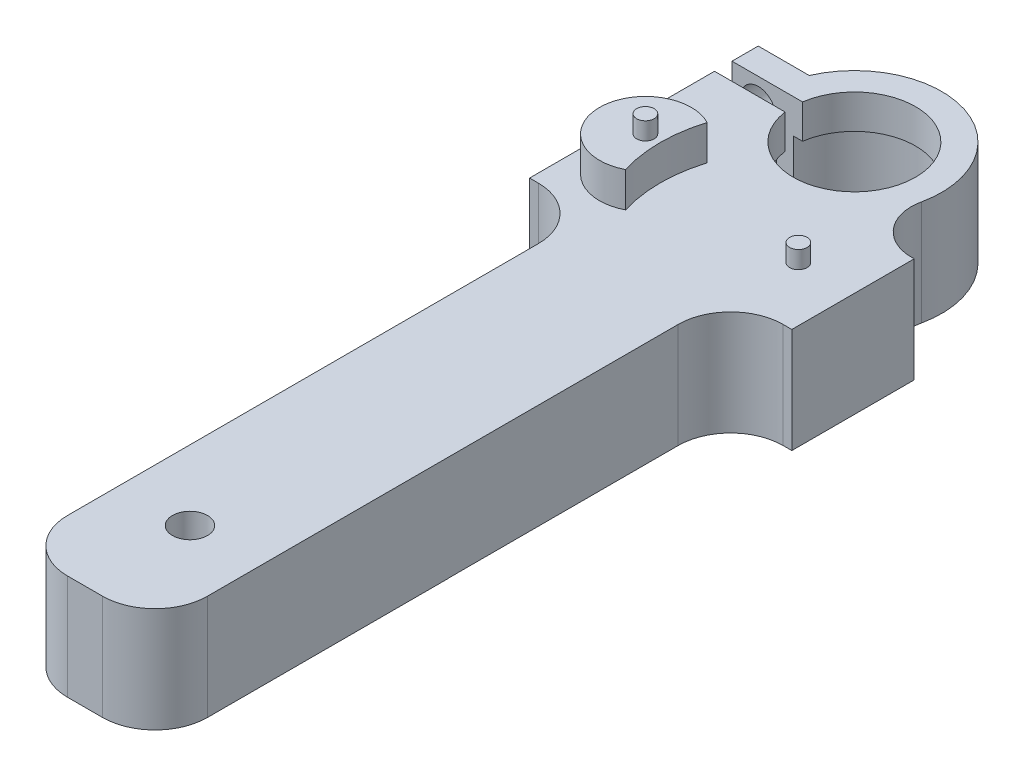
ISO-10303-21;
HEADER;
FILE_DESCRIPTION(('STEP AP214'),'2;1');
FILE_NAME('part.step','',(''),(''),'','','');
FILE_SCHEMA(('AUTOMOTIVE_DESIGN { 1 0 10303 214 1 1 1 1 }'));
ENDSEC;
DATA;
#1=APPLICATION_CONTEXT('core data for automotive mechanical design processes');
#2=APPLICATION_PROTOCOL_DEFINITION('international standard','automotive_design',2000,#1);
#3=PRODUCT_CONTEXT('',#1,'mechanical');
#4=PRODUCT('Part','Part','',(#3));
#5=PRODUCT_RELATED_PRODUCT_CATEGORY('part','',(#4));
#6=PRODUCT_DEFINITION_FORMATION('','',#4);
#7=PRODUCT_DEFINITION_CONTEXT('part definition',#1,'design');
#8=PRODUCT_DEFINITION('design','',#6,#7);
#9=PRODUCT_DEFINITION_SHAPE('','',#8);
#10=(LENGTH_UNIT() NAMED_UNIT(*) SI_UNIT(.MILLI.,.METRE.));
#11=(NAMED_UNIT(*) PLANE_ANGLE_UNIT() SI_UNIT($,.RADIAN.));
#12=(NAMED_UNIT(*) SI_UNIT($,.STERADIAN.) SOLID_ANGLE_UNIT());
#13=UNCERTAINTY_MEASURE_WITH_UNIT(LENGTH_MEASURE(1.E-05),#10,'distance_accuracy_value','');
#14=(GEOMETRIC_REPRESENTATION_CONTEXT(3) GLOBAL_UNCERTAINTY_ASSIGNED_CONTEXT((#13)) GLOBAL_UNIT_ASSIGNED_CONTEXT((#10,
#11,#12)) REPRESENTATION_CONTEXT('',''));
#15=CARTESIAN_POINT('',(0.,0.,0.));
#16=DIRECTION('',(0.,0.,1.));
#17=DIRECTION('',(1.,0.,0.));
#18=AXIS2_PLACEMENT_3D('',#15,#16,#17);
#19=CARTESIAN_POINT('',(0.,3.,-44.));
#20=DIRECTION('',(0.,-1.,0.));
#21=DIRECTION('',(0.,0.,-1.));
#22=AXIS2_PLACEMENT_3D('',#19,#20,#21);
#23=CYLINDRICAL_SURFACE('',#22,5.);
#24=DIRECTION('',(0.,1.,0.));
#25=VECTOR('',#24,1.);
#26=CARTESIAN_POINT('',(4.88811676517046,-7.50105620675398,-42.9481851445908));
#27=LINE('',#26,#25);
#28=CARTESIAN_POINT('',(4.88811676517046,-3.,-42.9481851445908));
#29=VERTEX_POINT('',#28);
#30=CARTESIAN_POINT('',(4.88811676517046,3.,-42.9481851445908));
#31=VERTEX_POINT('',#30);
#32=EDGE_CURVE('E229',#29,#31,#27,.T.);
#33=ORIENTED_EDGE('',*,*,#32,.F.);
#34=CARTESIAN_POINT('',(0.,-3.,-44.));
#35=DIRECTION('',(0.,-1.,0.));
#36=DIRECTION('',(0.,0.,-1.));
#37=AXIS2_PLACEMENT_3D('',#34,#35,#36);
#38=CIRCLE('',#37,5.);
#39=CARTESIAN_POINT('',(-4.58257569495584,-3.,-46.));
#40=VERTEX_POINT('',#39);
#41=EDGE_CURVE('E225',#40,#29,#38,.T.);
#42=ORIENTED_EDGE('',*,*,#41,.F.);
#43=DIRECTION('',(0.,-1.,0.));
#44=VECTOR('',#43,1.);
#45=CARTESIAN_POINT('',(-4.58257569495584,3.,-46.));
#46=LINE('',#45,#44);
#47=CARTESIAN_POINT('',(-4.58257569495584,3.,-46.));
#48=VERTEX_POINT('',#47);
#49=EDGE_CURVE('E387',#40,#48,#46,.F.);
#50=ORIENTED_EDGE('',*,*,#49,.T.);
#51=CARTESIAN_POINT('',(0.,3.,-44.));
#52=DIRECTION('',(0.,1.,0.));
#53=DIRECTION('',(0.,0.,1.));
#54=AXIS2_PLACEMENT_3D('',#51,#52,#53);
#55=CIRCLE('',#54,5.);
#56=EDGE_CURVE('E426',#31,#48,#55,.T.);
#57=ORIENTED_EDGE('',*,*,#56,.F.);
#58=EDGE_LOOP('',(#33,#42,#50,#57));
#59=FACE_BOUND('',#58,.T.);
#60=ADVANCED_FACE('F47',(#59),#23,.T.);
#61=CARTESIAN_POINT('',(-7.5,-16.5529453572468,-32.9222777168862));
#62=DIRECTION('',(-1.,0.,0.));
#63=DIRECTION('',(0.,0.,1.));
#64=AXIS2_PLACEMENT_3D('',#61,#62,#63);
#65=PLANE('',#64);
#66=DIRECTION('',(0.,1.,0.));
#67=VECTOR('',#66,1.);
#68=CARTESIAN_POINT('',(-7.5,0.,-44.5));
#69=LINE('',#68,#67);
#70=CARTESIAN_POINT('',(-7.5,-3.,-44.5));
#71=VERTEX_POINT('',#70);
#72=CARTESIAN_POINT('',(-7.5,3.,-44.5));
#73=VERTEX_POINT('',#72);
#74=EDGE_CURVE('E347',#71,#73,#69,.T.);
#75=ORIENTED_EDGE('',*,*,#74,.T.);
#76=DIRECTION('',(0.,0.,1.));
#77=VECTOR('',#76,1.);
#78=CARTESIAN_POINT('',(-7.5,3.,-32.9222777168862));
#79=LINE('',#78,#77);
#80=CARTESIAN_POINT('',(-7.5,3.,-46.));
#81=VERTEX_POINT('',#80);
#82=EDGE_CURVE('E397',#81,#73,#79,.T.);
#83=ORIENTED_EDGE('',*,*,#82,.F.);
#84=DIRECTION('',(0.,1.,0.));
#85=VECTOR('',#84,1.);
#86=CARTESIAN_POINT('',(-7.5,-7.01346620086376,-46.));
#87=LINE('',#86,#85);
#88=CARTESIAN_POINT('',(-7.5,-3.,-46.));
#89=VERTEX_POINT('',#88);
#90=EDGE_CURVE('E382',#89,#81,#87,.T.);
#91=ORIENTED_EDGE('',*,*,#90,.F.);
#92=DIRECTION('',(0.,0.,-1.));
#93=VECTOR('',#92,1.);
#94=CARTESIAN_POINT('',(-7.5,-3.,-44.5));
#95=LINE('',#94,#93);
#96=EDGE_CURVE('E284',#71,#89,#95,.T.);
#97=ORIENTED_EDGE('',*,*,#96,.F.);
#98=EDGE_LOOP('',(#75,#83,#91,#97));
#99=FACE_BOUND('',#98,.T.);
#100=ADVANCED_FACE('F563',(#99),#65,.T.);
#101=CARTESIAN_POINT('',(0.,3.,-44.));
#102=DIRECTION('',(0.,-1.,0.));
#103=DIRECTION('',(0.,0.,-1.));
#104=AXIS2_PLACEMENT_3D('',#101,#102,#103);
#105=CYLINDRICAL_SURFACE('',#104,4.);
#106=DIRECTION('',(0.,-1.,0.));
#107=VECTOR('',#106,1.);
#108=CARTESIAN_POINT('',(-3.96862696659689,3.,-44.5));
#109=LINE('',#108,#107);
#110=CARTESIAN_POINT('',(-3.96862696659689,-3.,-44.5));
#111=VERTEX_POINT('',#110);
#112=CARTESIAN_POINT('',(-3.96862696659689,1.05,-44.5));
#113=VERTEX_POINT('',#112);
#114=EDGE_CURVE('E364',#111,#113,#109,.F.);
#115=ORIENTED_EDGE('',*,*,#114,.F.);
#116=CARTESIAN_POINT('',(0.,-3.,-44.));
#117=DIRECTION('',(0.,1.,0.));
#118=DIRECTION('',(0.,0.,-1.));
#119=AXIS2_PLACEMENT_3D('',#116,#117,#118);
#120=CIRCLE('',#119,4.);
#121=CARTESIAN_POINT('',(-3.96862696659689,-3.,-43.5));
#122=VERTEX_POINT('',#121);
#123=EDGE_CURVE('E276',#122,#111,#120,.T.);
#124=ORIENTED_EDGE('',*,*,#123,.F.);
#125=DIRECTION('',(0.,-1.,0.));
#126=VECTOR('',#125,1.);
#127=CARTESIAN_POINT('',(-3.96862696659689,3.,-43.5));
#128=LINE('',#127,#126);
#129=CARTESIAN_POINT('',(-3.96862696659689,1.05,-43.5));
#130=VERTEX_POINT('',#129);
#131=EDGE_CURVE('E357',#130,#122,#128,.T.);
#132=ORIENTED_EDGE('',*,*,#131,.F.);
#133=CARTESIAN_POINT('',(0.,1.05,-44.));
#134=DIRECTION('',(0.,1.,0.));
#135=DIRECTION('',(0.,0.,1.));
#136=AXIS2_PLACEMENT_3D('',#133,#134,#135);
#137=CIRCLE('',#136,4.00000000000001);
#138=EDGE_CURVE('E372',#130,#113,#137,.T.);
#139=ORIENTED_EDGE('',*,*,#138,.T.);
#140=EDGE_LOOP('',(#115,#124,#132,#139));
#141=FACE_BOUND('',#140,.T.);
#142=ADVANCED_FACE('F572',(#141),#105,.F.);
#143=CARTESIAN_POINT('',(4.,3.,0.));
#144=DIRECTION('',(-1.,0.,0.));
#145=DIRECTION('',(0.,0.,1.));
#146=AXIS2_PLACEMENT_3D('',#143,#144,#145);
#147=PLANE('',#146);
#148=DIRECTION('',(0.,0.,-1.));
#149=VECTOR('',#148,1.);
#150=CARTESIAN_POINT('',(4.,3.,0.));
#151=LINE('',#150,#149);
#152=CARTESIAN_POINT('',(4.,3.,-3.));
#153=VERTEX_POINT('',#152);
#154=CARTESIAN_POINT('',(4.,3.,-29.9222777168862));
#155=VERTEX_POINT('',#154);
#156=EDGE_CURVE('E437',#153,#155,#151,.T.);
#157=ORIENTED_EDGE('',*,*,#156,.F.);
#158=DIRECTION('',(0.,-1.,0.));
#159=VECTOR('',#158,1.);
#160=CARTESIAN_POINT('',(4.,3.,-3.));
#161=LINE('',#160,#159);
#162=CARTESIAN_POINT('',(4.,-3.01,-3.));
#163=VERTEX_POINT('',#162);
#164=EDGE_CURVE('E483',#153,#163,#161,.T.);
#165=ORIENTED_EDGE('',*,*,#164,.T.);
#166=DIRECTION('',(0.,0.,1.));
#167=VECTOR('',#166,1.);
#168=CARTESIAN_POINT('',(4.,-3.01,-16.7819293264239));
#169=LINE('',#168,#167);
#170=CARTESIAN_POINT('',(4.,-3.01,-16.7819293264239));
#171=VERTEX_POINT('',#170);
#172=EDGE_CURVE('E700',#171,#163,#169,.T.);
#173=ORIENTED_EDGE('',*,*,#172,.F.);
#174=DIRECTION('',(0.,1.,0.));
#175=VECTOR('',#174,1.);
#176=CARTESIAN_POINT('',(4.,-3.01,-16.7819293264239));
#177=LINE('',#176,#175);
#178=CARTESIAN_POINT('',(4.,-3.,-16.7819293264239));
#179=VERTEX_POINT('',#178);
#180=EDGE_CURVE('E246',#171,#179,#177,.T.);
#181=ORIENTED_EDGE('',*,*,#180,.T.);
#182=DIRECTION('',(0.,0.,1.));
#183=VECTOR('',#182,1.);
#184=CARTESIAN_POINT('',(4.,-3.,-32.9222777168862));
#185=LINE('',#184,#183);
#186=CARTESIAN_POINT('',(4.,-3.,-29.9222777168862));
#187=VERTEX_POINT('',#186);
#188=EDGE_CURVE('E259',#187,#179,#185,.T.);
#189=ORIENTED_EDGE('',*,*,#188,.F.);
#190=DIRECTION('',(0.,1.,0.));
#191=VECTOR('',#190,1.);
#192=CARTESIAN_POINT('',(4.,3.,-29.9222777168862));
#193=LINE('',#192,#191);
#194=EDGE_CURVE('E479',#187,#155,#193,.T.);
#195=ORIENTED_EDGE('',*,*,#194,.T.);
#196=EDGE_LOOP('',(#157,#165,#173,#181,#189,#195));
#197=FACE_BOUND('',#196,.T.);
#198=ADVANCED_FACE('F542',(#197),#147,.F.);
#199=CARTESIAN_POINT('',(-4.,3.,0.));
#200=DIRECTION('',(1.,0.,0.));
#201=DIRECTION('',(0.,0.,-1.));
#202=AXIS2_PLACEMENT_3D('',#199,#200,#201);
#203=PLANE('',#202);
#204=DIRECTION('',(0.,0.,-1.));
#205=VECTOR('',#204,1.);
#206=CARTESIAN_POINT('',(-4.,-3.01,0.));
#207=LINE('',#206,#205);
#208=CARTESIAN_POINT('',(-4.,-3.01,-3.));
#209=VERTEX_POINT('',#208);
#210=CARTESIAN_POINT('',(-4.,-3.01,-16.7819293264239));
#211=VERTEX_POINT('',#210);
#212=EDGE_CURVE('E525',#209,#211,#207,.T.);
#213=ORIENTED_EDGE('',*,*,#212,.F.);
#214=DIRECTION('',(0.,-1.,0.));
#215=VECTOR('',#214,1.);
#216=CARTESIAN_POINT('',(-4.,3.,-3.));
#217=LINE('',#216,#215);
#218=CARTESIAN_POINT('',(-4.,3.,-3.));
#219=VERTEX_POINT('',#218);
#220=EDGE_CURVE('E470',#209,#219,#217,.F.);
#221=ORIENTED_EDGE('',*,*,#220,.T.);
#222=DIRECTION('',(0.,0.,1.));
#223=VECTOR('',#222,1.);
#224=CARTESIAN_POINT('',(-4.,3.,0.));
#225=LINE('',#224,#223);
#226=CARTESIAN_POINT('',(-4.,3.,-29.9222777168862));
#227=VERTEX_POINT('',#226);
#228=EDGE_CURVE('E429',#227,#219,#225,.T.);
#229=ORIENTED_EDGE('',*,*,#228,.F.);
#230=DIRECTION('',(0.,-1.,0.));
#231=VECTOR('',#230,1.);
#232=CARTESIAN_POINT('',(-4.,3.,-29.9222777168862));
#233=LINE('',#232,#231);
#234=CARTESIAN_POINT('',(-4.,-3.,-29.9222777168862));
#235=VERTEX_POINT('',#234);
#236=EDGE_CURVE('E466',#227,#235,#233,.T.);
#237=ORIENTED_EDGE('',*,*,#236,.T.);
#238=DIRECTION('',(0.,0.,-1.));
#239=VECTOR('',#238,1.);
#240=CARTESIAN_POINT('',(-4.,-3.,0.));
#241=LINE('',#240,#239);
#242=CARTESIAN_POINT('',(-4.,-3.,-16.7819293264239));
#243=VERTEX_POINT('',#242);
#244=EDGE_CURVE('E262',#243,#235,#241,.T.);
#245=ORIENTED_EDGE('',*,*,#244,.F.);
#246=DIRECTION('',(0.,1.,0.));
#247=VECTOR('',#246,1.);
#248=CARTESIAN_POINT('',(-4.,-3.01,-16.7819293264239));
#249=LINE('',#248,#247);
#250=EDGE_CURVE('E253',#211,#243,#249,.T.);
#251=ORIENTED_EDGE('',*,*,#250,.F.);
#252=EDGE_LOOP('',(#213,#221,#229,#237,#245,#251));
#253=FACE_BOUND('',#252,.T.);
#254=ADVANCED_FACE('F521',(#253),#203,.F.);
#255=CARTESIAN_POINT('',(-4.,3.,0.));
#256=DIRECTION('',(0.,0.,-1.));
#257=DIRECTION('',(-1.,0.,0.));
#258=AXIS2_PLACEMENT_3D('',#255,#256,#257);
#259=PLANE('',#258);
#260=DIRECTION('',(1.,0.,0.));
#261=VECTOR('',#260,1.);
#262=CARTESIAN_POINT('',(-4.,3.,0.));
#263=LINE('',#262,#261);
#264=CARTESIAN_POINT('',(-1.,3.,0.));
#265=VERTEX_POINT('',#264);
#266=CARTESIAN_POINT('',(1.,3.,0.));
#267=VERTEX_POINT('',#266);
#268=EDGE_CURVE('E433',#265,#267,#263,.T.);
#269=ORIENTED_EDGE('',*,*,#268,.F.);
#270=DIRECTION('',(0.,-1.,0.));
#271=VECTOR('',#270,1.);
#272=CARTESIAN_POINT('',(-1.,3.,0.));
#273=LINE('',#272,#271);
#274=CARTESIAN_POINT('',(-1.,-3.01,0.));
#275=VERTEX_POINT('',#274);
#276=EDGE_CURVE('E456',#265,#275,#273,.T.);
#277=ORIENTED_EDGE('',*,*,#276,.T.);
#278=DIRECTION('',(-1.,0.,0.));
#279=VECTOR('',#278,1.);
#280=CARTESIAN_POINT('',(4.,-3.01,0.));
#281=LINE('',#280,#279);
#282=CARTESIAN_POINT('',(1.,-3.01,0.));
#283=VERTEX_POINT('',#282);
#284=EDGE_CURVE('E536',#283,#275,#281,.T.);
#285=ORIENTED_EDGE('',*,*,#284,.F.);
#286=DIRECTION('',(0.,-1.,0.));
#287=VECTOR('',#286,1.);
#288=CARTESIAN_POINT('',(1.,3.,0.));
#289=LINE('',#288,#287);
#290=EDGE_CURVE('E453',#283,#267,#289,.F.);
#291=ORIENTED_EDGE('',*,*,#290,.T.);
#292=EDGE_LOOP('',(#269,#277,#285,#291));
#293=FACE_BOUND('',#292,.T.);
#294=ADVANCED_FACE('F532',(#293),#259,.F.);
#295=CARTESIAN_POINT('',(0.,3.,0.));
#296=DIRECTION('',(0.,-1.,0.));
#297=DIRECTION('',(0.,0.,-1.));
#298=AXIS2_PLACEMENT_3D('',#295,#296,#297);
#299=PLANE('',#298);
#300=CARTESIAN_POINT('',(7.33217514775569,3.,-42.4222777168862));
#301=DIRECTION('',(0.,-1.,0.));
#302=DIRECTION('',(0.,0.,1.));
#303=AXIS2_PLACEMENT_3D('',#300,#301,#302);
#304=CIRCLE('',#303,2.5);
#305=CARTESIAN_POINT('',(7.33217514775569,3.,-39.9222777168862));
#306=VERTEX_POINT('',#305);
#307=EDGE_CURVE('E235',#306,#31,#304,.T.);
#308=ORIENTED_EDGE('',*,*,#307,.T.);
#309=ORIENTED_EDGE('',*,*,#56,.T.);
#310=DIRECTION('',(-1.,0.,0.));
#311=VECTOR('',#310,1.);
#312=CARTESIAN_POINT('',(-4.,3.,-46.));
#313=LINE('',#312,#311);
#314=EDGE_CURVE('E379',#48,#81,#313,.T.);
#315=ORIENTED_EDGE('',*,*,#314,.T.);
#316=ORIENTED_EDGE('',*,*,#82,.T.);
#317=DIRECTION('',(-1.,0.,0.));
#318=VECTOR('',#317,1.);
#319=CARTESIAN_POINT('',(-7.5,3.,-44.5));
#320=LINE('',#319,#318);
#321=CARTESIAN_POINT('',(-3.46410161513776,3.,-44.5));
#322=VERTEX_POINT('',#321);
#323=EDGE_CURVE('E343',#322,#73,#320,.T.);
#324=ORIENTED_EDGE('',*,*,#323,.F.);
#325=CARTESIAN_POINT('',(0.,3.,-44.));
#326=DIRECTION('',(0.,1.,0.));
#327=DIRECTION('',(0.,0.,1.));
#328=AXIS2_PLACEMENT_3D('',#325,#326,#327);
#329=CIRCLE('',#328,3.5);
#330=CARTESIAN_POINT('',(-3.46410161513776,3.,-43.5));
#331=VERTEX_POINT('',#330);
#332=EDGE_CURVE('E367',#331,#322,#329,.T.);
#333=ORIENTED_EDGE('',*,*,#332,.F.);
#334=DIRECTION('',(1.,0.,0.));
#335=VECTOR('',#334,1.);
#336=CARTESIAN_POINT('',(-7.5,3.,-43.5));
#337=LINE('',#336,#335);
#338=CARTESIAN_POINT('',(-7.5,3.,-43.5));
#339=VERTEX_POINT('',#338);
#340=EDGE_CURVE('E340',#339,#331,#337,.T.);
#341=ORIENTED_EDGE('',*,*,#340,.F.);
#342=CARTESIAN_POINT('',(-7.5,3.,-32.9222777168862));
#343=VERTEX_POINT('',#342);
#344=EDGE_CURVE('E401',#339,#343,#79,.T.);
#345=ORIENTED_EDGE('',*,*,#344,.T.);
#346=DIRECTION('',(1.,0.,0.));
#347=VECTOR('',#346,1.);
#348=CARTESIAN_POINT('',(-7.5,3.,-32.9222777168862));
#349=LINE('',#348,#347);
#350=CARTESIAN_POINT('',(-7.,3.,-32.9222777168862));
#351=VERTEX_POINT('',#350);
#352=EDGE_CURVE('E391',#343,#351,#349,.T.);
#353=ORIENTED_EDGE('',*,*,#352,.T.);
#354=CARTESIAN_POINT('',(-7.,3.,-29.9222777168862));
#355=DIRECTION('',(0.,-1.,0.));
#356=DIRECTION('',(0.,0.,-1.));
#357=AXIS2_PLACEMENT_3D('',#354,#355,#356);
#358=CIRCLE('',#357,3.);
#359=EDGE_CURVE('E12',#351,#227,#358,.T.);
#360=ORIENTED_EDGE('',*,*,#359,.T.);
#361=ORIENTED_EDGE('',*,*,#228,.T.);
#362=CARTESIAN_POINT('',(-1.,3.,-3.));
#363=DIRECTION('',(0.,-1.,0.));
#364=DIRECTION('',(0.,0.,-1.));
#365=AXIS2_PLACEMENT_3D('',#362,#363,#364);
#366=CIRCLE('',#365,3.);
#367=EDGE_CURVE('E476',#219,#265,#366,.F.);
#368=ORIENTED_EDGE('',*,*,#367,.T.);
#369=ORIENTED_EDGE('',*,*,#268,.T.);
#370=CARTESIAN_POINT('',(1.,3.,-3.));
#371=DIRECTION('',(0.,-1.,0.));
#372=DIRECTION('',(0.,0.,-1.));
#373=AXIS2_PLACEMENT_3D('',#370,#371,#372);
#374=CIRCLE('',#373,3.);
#375=EDGE_CURVE('E473',#267,#153,#374,.F.);
#376=ORIENTED_EDGE('',*,*,#375,.T.);
#377=ORIENTED_EDGE('',*,*,#156,.T.);
#378=CARTESIAN_POINT('',(7.,3.,-29.9222777168862));
#379=DIRECTION('',(0.,-1.,0.));
#380=DIRECTION('',(0.,0.,-1.));
#381=AXIS2_PLACEMENT_3D('',#378,#379,#380);
#382=CIRCLE('',#381,3.);
#383=CARTESIAN_POINT('',(7.,3.,-32.9222777168862));
#384=VERTEX_POINT('',#383);
#385=EDGE_CURVE('E492',#155,#384,#382,.T.);
#386=ORIENTED_EDGE('',*,*,#385,.T.);
#387=CARTESIAN_POINT('',(7.5,3.,-32.9222777168862));
#388=VERTEX_POINT('',#387);
#389=EDGE_CURVE('E396',#384,#388,#349,.T.);
#390=ORIENTED_EDGE('',*,*,#389,.T.);
#391=DIRECTION('',(0.,0.,-1.));
#392=VECTOR('',#391,1.);
#393=CARTESIAN_POINT('',(7.5,3.,-32.9222777168862));
#394=LINE('',#393,#392);
#395=CARTESIAN_POINT('',(7.5,3.,-39.9222777168862));
#396=VERTEX_POINT('',#395);
#397=EDGE_CURVE('E405',#388,#396,#394,.T.);
#398=ORIENTED_EDGE('',*,*,#397,.T.);
#399=DIRECTION('',(-1.,0.,0.));
#400=VECTOR('',#399,1.);
#401=CARTESIAN_POINT('',(-7.5,3.,-39.9222777168862));
#402=LINE('',#401,#400);
#403=EDGE_CURVE('E402',#396,#306,#402,.T.);
#404=ORIENTED_EDGE('',*,*,#403,.T.);
#405=EDGE_LOOP('',(#308,#309,#315,#316,#324,#333,#341,#345,#353,#360,#361,#368,#369,#376,#377,
#386,#390,#398,#404));
#406=FACE_BOUND('',#405,.T.);
#407=CARTESIAN_POINT('',(4.375,3.,-36.4222777168862));
#408=DIRECTION('',(0.,-1.,0.));
#409=DIRECTION('',(0.,0.,1.));
#410=AXIS2_PLACEMENT_3D('',#407,#408,#409);
#411=CIRCLE('',#410,7.9);
#412=CARTESIAN_POINT('',(-3.17253571428572,3.,-34.0888886276896));
#413=VERTEX_POINT('',#412);
#414=CARTESIAN_POINT('',(-3.17253571428572,3.,-38.7556668060827));
#415=VERTEX_POINT('',#414);
#416=EDGE_CURVE('E309',#413,#415,#411,.T.);
#417=ORIENTED_EDGE('',*,*,#416,.F.);
#418=CARTESIAN_POINT('',(-4.375,3.,-36.4222777168862));
#419=DIRECTION('',(0.,1.,0.));
#420=DIRECTION('',(0.,0.,1.));
#421=AXIS2_PLACEMENT_3D('',#418,#419,#420);
#422=CIRCLE('',#421,2.625);
#423=EDGE_CURVE('E315',#415,#413,#422,.T.);
#424=ORIENTED_EDGE('',*,*,#423,.F.);
#425=EDGE_LOOP('',(#417,#424));
#426=FACE_BOUND('',#425,.T.);
#427=CARTESIAN_POINT('',(4.375,3.,-36.4222777168862));
#428=DIRECTION('',(0.,1.,0.));
#429=DIRECTION('',(0.,0.,1.));
#430=AXIS2_PLACEMENT_3D('',#427,#428,#429);
#431=CIRCLE('',#430,0.500000000000041);
#432=CARTESIAN_POINT('',(4.375,3.,-35.9222777168861));
#433=VERTEX_POINT('',#432);
#434=EDGE_CURVE('E409',#433,#433,#431,.T.);
#435=ORIENTED_EDGE('',*,*,#434,.F.);
#436=EDGE_LOOP('',(#435));
#437=FACE_BOUND('',#436,.T.);
#438=CARTESIAN_POINT('',(0.,2.9999999999998,-6.));
#439=DIRECTION('',(0.,1.,0.));
#440=DIRECTION('',(0.,0.,1.));
#441=AXIS2_PLACEMENT_3D('',#438,#439,#440);
#442=CIRCLE('',#441,0.999999999999987);
#443=CARTESIAN_POINT('',(0.,2.9999999999998,-5.00000000000001));
#444=VERTEX_POINT('',#443);
#445=EDGE_CURVE('E395',#444,#444,#442,.T.);
#446=ORIENTED_EDGE('',*,*,#445,.F.);
#447=EDGE_LOOP('',(#446));
#448=FACE_BOUND('',#447,.T.);
#449=ADVANCED_FACE('F503',(#406,#426,#437,#448),#299,.F.);
#450=CARTESIAN_POINT('',(0.,2.9999999999998,-6.));
#451=DIRECTION('',(0.,1.,0.));
#452=DIRECTION('',(0.,0.,1.));
#453=AXIS2_PLACEMENT_3D('',#450,#451,#452);
#454=CYLINDRICAL_SURFACE('',#453,0.999999999999993);
#455=ORIENTED_EDGE('',*,*,#445,.T.);
#456=EDGE_LOOP('',(#455));
#457=FACE_BOUND('',#456,.T.);
#458=CARTESIAN_POINT('',(0.,-3.01,-6.));
#459=DIRECTION('',(0.,-1.,0.));
#460=DIRECTION('',(0.,0.,-1.));
#461=AXIS2_PLACEMENT_3D('',#458,#459,#460);
#462=CIRCLE('',#461,0.999999999999998);
#463=CARTESIAN_POINT('',(0.,-3.01,-7.));
#464=VERTEX_POINT('',#463);
#465=EDGE_CURVE('E685',#464,#464,#462,.T.);
#466=ORIENTED_EDGE('',*,*,#465,.T.);
#467=EDGE_LOOP('',(#466));
#468=FACE_BOUND('',#467,.T.);
#469=ADVANCED_FACE('F603',(#457,#468),#454,.F.);
#470=CARTESIAN_POINT('',(7.5,-16.5529453572468,-32.9222777168862));
#471=DIRECTION('',(1.,0.,0.));
#472=DIRECTION('',(0.,0.,-1.));
#473=AXIS2_PLACEMENT_3D('',#470,#471,#472);
#474=PLANE('',#473);
#475=DIRECTION('',(0.,1.,0.));
#476=VECTOR('',#475,1.);
#477=CARTESIAN_POINT('',(7.5,-16.5529453572468,-32.9222777168862));
#478=LINE('',#477,#476);
#479=CARTESIAN_POINT('',(7.5,-3.,-32.9222777168862));
#480=VERTEX_POINT('',#479);
#481=EDGE_CURVE('E414',#480,#388,#478,.T.);
#482=ORIENTED_EDGE('',*,*,#481,.F.);
#483=DIRECTION('',(0.,0.,1.));
#484=VECTOR('',#483,1.);
#485=CARTESIAN_POINT('',(7.5,-3.,-39.9222777168862));
#486=LINE('',#485,#484);
#487=CARTESIAN_POINT('',(7.5,-3.,-39.9222777168862));
#488=VERTEX_POINT('',#487);
#489=EDGE_CURVE('E245',#488,#480,#486,.T.);
#490=ORIENTED_EDGE('',*,*,#489,.F.);
#491=DIRECTION('',(0.,1.,0.));
#492=VECTOR('',#491,1.);
#493=CARTESIAN_POINT('',(7.5,-16.5529453572468,-39.9222777168862));
#494=LINE('',#493,#492);
#495=EDGE_CURVE('E242',#488,#396,#494,.T.);
#496=ORIENTED_EDGE('',*,*,#495,.T.);
#497=ORIENTED_EDGE('',*,*,#397,.F.);
#498=EDGE_LOOP('',(#482,#490,#496,#497));
#499=FACE_BOUND('',#498,.T.);
#500=ADVANCED_FACE('F552',(#499),#474,.T.);
#501=CARTESIAN_POINT('',(-7.5,-16.5529453572468,-39.9222777168862));
#502=DIRECTION('',(0.,0.,-1.));
#503=DIRECTION('',(-1.,0.,0.));
#504=AXIS2_PLACEMENT_3D('',#501,#502,#503);
#505=PLANE('',#504);
#506=DIRECTION('',(0.,1.,0.));
#507=VECTOR('',#506,1.);
#508=CARTESIAN_POINT('',(7.33217514775569,-7.50105620675398,-39.9222777168862));
#509=LINE('',#508,#507);
#510=CARTESIAN_POINT('',(7.33217514775569,-3.,-39.9222777168862));
#511=VERTEX_POINT('',#510);
#512=EDGE_CURVE('E230',#511,#306,#509,.T.);
#513=ORIENTED_EDGE('',*,*,#512,.T.);
#514=ORIENTED_EDGE('',*,*,#403,.F.);
#515=ORIENTED_EDGE('',*,*,#495,.F.);
#516=DIRECTION('',(1.,0.,0.));
#517=VECTOR('',#516,1.);
#518=CARTESIAN_POINT('',(4.,-3.,-39.9222777168862));
#519=LINE('',#518,#517);
#520=EDGE_CURVE('E221',#511,#488,#519,.T.);
#521=ORIENTED_EDGE('',*,*,#520,.F.);
#522=EDGE_LOOP('',(#513,#514,#515,#521));
#523=FACE_BOUND('',#522,.T.);
#524=ADVANCED_FACE('F241',(#523),#505,.T.);
#525=CARTESIAN_POINT('',(-7.5,-16.5529453572468,-32.9222777168862));
#526=DIRECTION('',(0.,0.,1.));
#527=DIRECTION('',(1.,0.,0.));
#528=AXIS2_PLACEMENT_3D('',#525,#526,#527);
#529=PLANE('',#528);
#530=ORIENTED_EDGE('',*,*,#389,.F.);
#531=DIRECTION('',(0.,1.,0.));
#532=VECTOR('',#531,1.);
#533=CARTESIAN_POINT('',(7.,-16.5529453572468,-32.9222777168862));
#534=LINE('',#533,#532);
#535=CARTESIAN_POINT('',(7.,-3.,-32.9222777168862));
#536=VERTEX_POINT('',#535);
#537=EDGE_CURVE('E70',#384,#536,#534,.F.);
#538=ORIENTED_EDGE('',*,*,#537,.T.);
#539=DIRECTION('',(-1.,0.,0.));
#540=VECTOR('',#539,1.);
#541=CARTESIAN_POINT('',(7.5,-3.,-32.9222777168862));
#542=LINE('',#541,#540);
#543=EDGE_CURVE('E250',#480,#536,#542,.T.);
#544=ORIENTED_EDGE('',*,*,#543,.F.);
#545=ORIENTED_EDGE('',*,*,#481,.T.);
#546=EDGE_LOOP('',(#530,#538,#544,#545));
#547=FACE_BOUND('',#546,.T.);
#548=ADVANCED_FACE('F549',(#547),#529,.T.);
#549=DIRECTION('',(-1.,0.,0.));
#550=VECTOR('',#549,1.);
#551=CARTESIAN_POINT('',(-4.,-3.,-32.9222777168862));
#552=LINE('',#551,#550);
#553=CARTESIAN_POINT('',(-7.,-3.,-32.9222777168862));
#554=VERTEX_POINT('',#553);
#555=CARTESIAN_POINT('',(-7.5,-3.,-32.9222777168862));
#556=VERTEX_POINT('',#555);
#557=EDGE_CURVE('E265',#554,#556,#552,.T.);
#558=ORIENTED_EDGE('',*,*,#557,.F.);
#559=DIRECTION('',(0.,-1.,0.));
#560=VECTOR('',#559,1.);
#561=CARTESIAN_POINT('',(-7.,-16.5529453572468,-32.9222777168862));
#562=LINE('',#561,#560);
#563=EDGE_CURVE('E489',#554,#351,#562,.F.);
#564=ORIENTED_EDGE('',*,*,#563,.T.);
#565=ORIENTED_EDGE('',*,*,#352,.F.);
#566=DIRECTION('',(0.,1.,0.));
#567=VECTOR('',#566,1.);
#568=CARTESIAN_POINT('',(-7.5,-16.5529453572468,-32.9222777168862));
#569=LINE('',#568,#567);
#570=EDGE_CURVE('E413',#556,#343,#569,.T.);
#571=ORIENTED_EDGE('',*,*,#570,.F.);
#572=EDGE_LOOP('',(#558,#564,#565,#571));
#573=FACE_BOUND('',#572,.T.);
#574=ADVANCED_FACE('F513',(#573),#529,.T.);
#575=DIRECTION('',(0.,1.,0.));
#576=VECTOR('',#575,1.);
#577=CARTESIAN_POINT('',(-7.5,0.,-43.5));
#578=LINE('',#577,#576);
#579=CARTESIAN_POINT('',(-7.5,-3.,-43.5));
#580=VERTEX_POINT('',#579);
#581=EDGE_CURVE('E346',#580,#339,#578,.T.);
#582=ORIENTED_EDGE('',*,*,#581,.F.);
#583=DIRECTION('',(0.,0.,-1.));
#584=VECTOR('',#583,1.);
#585=CARTESIAN_POINT('',(-7.5,-3.,-32.9222777168862));
#586=LINE('',#585,#584);
#587=EDGE_CURVE('E268',#556,#580,#586,.T.);
#588=ORIENTED_EDGE('',*,*,#587,.F.);
#589=ORIENTED_EDGE('',*,*,#570,.T.);
#590=ORIENTED_EDGE('',*,*,#344,.F.);
#591=EDGE_LOOP('',(#582,#588,#589,#590));
#592=FACE_BOUND('',#591,.T.);
#593=ADVANCED_FACE('F511',(#592),#65,.T.);
#594=CARTESIAN_POINT('',(-4.,-7.01346620086376,-46.));
#595=DIRECTION('',(0.,0.,-1.));
#596=DIRECTION('',(-1.,0.,0.));
#597=AXIS2_PLACEMENT_3D('',#594,#595,#596);
#598=PLANE('',#597);
#599=CARTESIAN_POINT('',(-6.,1.5,-46.));
#600=DIRECTION('',(0.,0.,-1.));
#601=DIRECTION('',(-1.,0.,0.));
#602=AXIS2_PLACEMENT_3D('',#599,#600,#601);
#603=CIRCLE('',#602,1.);
#604=CARTESIAN_POINT('',(-7.,1.5,-46.));
#605=VERTEX_POINT('',#604);
#606=EDGE_CURVE('E297',#605,#605,#603,.T.);
#607=ORIENTED_EDGE('',*,*,#606,.F.);
#608=EDGE_LOOP('',(#607));
#609=FACE_BOUND('',#608,.T.);
#610=ORIENTED_EDGE('',*,*,#49,.F.);
#611=DIRECTION('',(1.,0.,0.));
#612=VECTOR('',#611,1.);
#613=CARTESIAN_POINT('',(-7.5,-3.,-46.));
#614=LINE('',#613,#612);
#615=EDGE_CURVE('E288',#89,#40,#614,.T.);
#616=ORIENTED_EDGE('',*,*,#615,.F.);
#617=ORIENTED_EDGE('',*,*,#90,.T.);
#618=ORIENTED_EDGE('',*,*,#314,.F.);
#619=EDGE_LOOP('',(#610,#616,#617,#618));
#620=FACE_BOUND('',#619,.T.);
#621=ADVANCED_FACE('F560',(#609,#620),#598,.T.);
#622=CARTESIAN_POINT('',(0.,1.05,-44.));
#623=DIRECTION('',(0.,1.,0.));
#624=DIRECTION('',(0.,0.,1.));
#625=AXIS2_PLACEMENT_3D('',#622,#623,#624);
#626=PLANE('',#625);
#627=CARTESIAN_POINT('',(0.,1.05,-44.));
#628=DIRECTION('',(0.,1.,0.));
#629=DIRECTION('',(0.,0.,1.));
#630=AXIS2_PLACEMENT_3D('',#627,#628,#629);
#631=CIRCLE('',#630,3.5);
#632=CARTESIAN_POINT('',(-3.46410161513776,1.05,-43.5));
#633=VERTEX_POINT('',#632);
#634=CARTESIAN_POINT('',(-3.46410161513776,1.05,-44.5));
#635=VERTEX_POINT('',#634);
#636=EDGE_CURVE('E368',#633,#635,#631,.T.);
#637=ORIENTED_EDGE('',*,*,#636,.T.);
#638=DIRECTION('',(-1.,0.,0.));
#639=VECTOR('',#638,1.);
#640=CARTESIAN_POINT('',(0.,1.05,-44.5));
#641=LINE('',#640,#639);
#642=EDGE_CURVE('E360',#635,#113,#641,.T.);
#643=ORIENTED_EDGE('',*,*,#642,.T.);
#644=ORIENTED_EDGE('',*,*,#138,.F.);
#645=DIRECTION('',(1.,0.,0.));
#646=VECTOR('',#645,1.);
#647=CARTESIAN_POINT('',(0.,1.05,-43.5));
#648=LINE('',#647,#646);
#649=EDGE_CURVE('E351',#130,#633,#648,.T.);
#650=ORIENTED_EDGE('',*,*,#649,.T.);
#651=EDGE_LOOP('',(#637,#643,#644,#650));
#652=FACE_BOUND('',#651,.T.);
#653=ADVANCED_FACE('F575',(#652),#626,.F.);
#654=CARTESIAN_POINT('',(0.,1.05,-44.));
#655=DIRECTION('',(0.,1.,0.));
#656=DIRECTION('',(0.,0.,1.));
#657=AXIS2_PLACEMENT_3D('',#654,#655,#656);
#658=CYLINDRICAL_SURFACE('',#657,3.5);
#659=ORIENTED_EDGE('',*,*,#332,.T.);
#660=DIRECTION('',(0.,1.,0.));
#661=VECTOR('',#660,1.);
#662=CARTESIAN_POINT('',(-3.46410161513776,1.05,-44.5));
#663=LINE('',#662,#661);
#664=EDGE_CURVE('E445',#322,#635,#663,.F.);
#665=ORIENTED_EDGE('',*,*,#664,.T.);
#666=ORIENTED_EDGE('',*,*,#636,.F.);
#667=DIRECTION('',(0.,1.,0.));
#668=VECTOR('',#667,1.);
#669=CARTESIAN_POINT('',(-3.46410161513776,1.05,-43.5));
#670=LINE('',#669,#668);
#671=EDGE_CURVE('E441',#633,#331,#670,.T.);
#672=ORIENTED_EDGE('',*,*,#671,.T.);
#673=EDGE_LOOP('',(#659,#665,#666,#672));
#674=FACE_BOUND('',#673,.T.);
#675=ADVANCED_FACE('F578',(#674),#658,.F.);
#676=CARTESIAN_POINT('',(-7.5,0.,-43.5));
#677=DIRECTION('',(0.,0.,1.));
#678=DIRECTION('',(1.,0.,0.));
#679=AXIS2_PLACEMENT_3D('',#676,#677,#678);
#680=PLANE('',#679);
#681=CARTESIAN_POINT('',(-6.,1.5,-43.5));
#682=DIRECTION('',(0.,0.,1.));
#683=DIRECTION('',(1.,0.,0.));
#684=AXIS2_PLACEMENT_3D('',#681,#682,#683);
#685=CIRCLE('',#684,0.799999999999994);
#686=CARTESIAN_POINT('',(-5.2,1.5,-43.5));
#687=VERTEX_POINT('',#686);
#688=EDGE_CURVE('E305',#687,#687,#685,.T.);
#689=ORIENTED_EDGE('',*,*,#688,.T.);
#690=EDGE_LOOP('',(#689));
#691=FACE_BOUND('',#690,.T.);
#692=ORIENTED_EDGE('',*,*,#131,.T.);
#693=DIRECTION('',(1.,0.,0.));
#694=VECTOR('',#693,1.);
#695=CARTESIAN_POINT('',(-7.5,-3.,-43.5));
#696=LINE('',#695,#694);
#697=EDGE_CURVE('E272',#580,#122,#696,.T.);
#698=ORIENTED_EDGE('',*,*,#697,.F.);
#699=ORIENTED_EDGE('',*,*,#581,.T.);
#700=ORIENTED_EDGE('',*,*,#340,.T.);
#701=ORIENTED_EDGE('',*,*,#671,.F.);
#702=ORIENTED_EDGE('',*,*,#649,.F.);
#703=EDGE_LOOP('',(#692,#698,#699,#700,#701,#702));
#704=FACE_BOUND('',#703,.T.);
#705=ADVANCED_FACE('F580',(#691,#704),#680,.F.);
#706=CARTESIAN_POINT('',(-7.5,0.,-44.5));
#707=DIRECTION('',(0.,0.,-1.));
#708=DIRECTION('',(-1.,0.,0.));
#709=AXIS2_PLACEMENT_3D('',#706,#707,#708);
#710=PLANE('',#709);
#711=CARTESIAN_POINT('',(-6.,1.5,-44.5));
#712=DIRECTION('',(0.,0.,-1.));
#713=DIRECTION('',(-1.,0.,0.));
#714=AXIS2_PLACEMENT_3D('',#711,#712,#713);
#715=CIRCLE('',#714,1.);
#716=CARTESIAN_POINT('',(-7.,1.5,-44.5));
#717=VERTEX_POINT('',#716);
#718=EDGE_CURVE('E293',#717,#717,#715,.F.);
#719=ORIENTED_EDGE('',*,*,#718,.F.);
#720=EDGE_LOOP('',(#719));
#721=FACE_BOUND('',#720,.T.);
#722=ORIENTED_EDGE('',*,*,#114,.T.);
#723=ORIENTED_EDGE('',*,*,#642,.F.);
#724=ORIENTED_EDGE('',*,*,#664,.F.);
#725=ORIENTED_EDGE('',*,*,#323,.T.);
#726=ORIENTED_EDGE('',*,*,#74,.F.);
#727=DIRECTION('',(-1.,0.,0.));
#728=VECTOR('',#727,1.);
#729=CARTESIAN_POINT('',(-3.96862696659689,-3.,-44.5));
#730=LINE('',#729,#728);
#731=EDGE_CURVE('E280',#111,#71,#730,.T.);
#732=ORIENTED_EDGE('',*,*,#731,.F.);
#733=EDGE_LOOP('',(#722,#723,#724,#725,#726,#732));
#734=FACE_BOUND('',#733,.T.);
#735=ADVANCED_FACE('F567',(#721,#734),#710,.F.);
#736=CARTESIAN_POINT('',(4.375,4.,-36.4222777168862));
#737=DIRECTION('',(0.,-1.,0.));
#738=DIRECTION('',(0.,0.,-1.));
#739=AXIS2_PLACEMENT_3D('',#736,#737,#738);
#740=CYLINDRICAL_SURFACE('',#739,0.500000000000044);
#741=CARTESIAN_POINT('',(4.375,4.,-36.4222777168862));
#742=DIRECTION('',(0.,-1.,0.));
#743=DIRECTION('',(0.,0.,-1.));
#744=AXIS2_PLACEMENT_3D('',#741,#742,#743);
#745=CIRCLE('',#744,0.500000000000044);
#746=CARTESIAN_POINT('',(4.375,4.,-36.9222777168862));
#747=VERTEX_POINT('',#746);
#748=EDGE_CURVE('E336',#747,#747,#745,.T.);
#749=ORIENTED_EDGE('',*,*,#748,.T.);
#750=EDGE_LOOP('',(#749));
#751=FACE_BOUND('',#750,.T.);
#752=ORIENTED_EDGE('',*,*,#434,.T.);
#753=EDGE_LOOP('',(#752));
#754=FACE_BOUND('',#753,.T.);
#755=ADVANCED_FACE('F588',(#751,#754),#740,.T.);
#756=CARTESIAN_POINT('',(4.375,4.,-36.4222777168862));
#757=DIRECTION('',(0.,-1.,0.));
#758=DIRECTION('',(0.,0.,-1.));
#759=AXIS2_PLACEMENT_3D('',#756,#757,#758);
#760=PLANE('',#759);
#761=ORIENTED_EDGE('',*,*,#748,.F.);
#762=EDGE_LOOP('',(#761));
#763=FACE_BOUND('',#762,.T.);
#764=ADVANCED_FACE('F659',(#763),#760,.F.);
#765=CARTESIAN_POINT('',(4.375,5.,-36.4222777168862));
#766=DIRECTION('',(0.,-1.,0.));
#767=DIRECTION('',(0.,0.,-1.));
#768=AXIS2_PLACEMENT_3D('',#765,#766,#767);
#769=CYLINDRICAL_SURFACE('',#768,7.9);
#770=ORIENTED_EDGE('',*,*,#416,.T.);
#771=DIRECTION('',(0.,-1.,0.));
#772=VECTOR('',#771,1.);
#773=CARTESIAN_POINT('',(-3.17253571428572,5.,-38.7556668060827));
#774=LINE('',#773,#772);
#775=CARTESIAN_POINT('',(-3.17253571428572,5.,-38.7556668060827));
#776=VERTEX_POINT('',#775);
#777=EDGE_CURVE('E328',#776,#415,#774,.T.);
#778=ORIENTED_EDGE('',*,*,#777,.F.);
#779=CARTESIAN_POINT('',(4.375,5.,-36.4222777168862));
#780=DIRECTION('',(0.,-1.,0.));
#781=DIRECTION('',(0.,0.,1.));
#782=AXIS2_PLACEMENT_3D('',#779,#780,#781);
#783=CIRCLE('',#782,7.9);
#784=CARTESIAN_POINT('',(-3.17253571428572,5.,-34.0888886276896));
#785=VERTEX_POINT('',#784);
#786=EDGE_CURVE('E310',#785,#776,#783,.T.);
#787=ORIENTED_EDGE('',*,*,#786,.F.);
#788=DIRECTION('',(0.,-1.,0.));
#789=VECTOR('',#788,1.);
#790=CARTESIAN_POINT('',(-3.17253571428572,5.,-34.0888886276896));
#791=LINE('',#790,#789);
#792=EDGE_CURVE('E318',#785,#413,#791,.T.);
#793=ORIENTED_EDGE('',*,*,#792,.T.);
#794=EDGE_LOOP('',(#770,#778,#787,#793));
#795=FACE_BOUND('',#794,.T.);
#796=ADVANCED_FACE('F655',(#795),#769,.F.);
#797=CARTESIAN_POINT('',(-4.375,5.,-36.4222777168862));
#798=DIRECTION('',(0.,-1.,0.));
#799=DIRECTION('',(0.,0.,-1.));
#800=AXIS2_PLACEMENT_3D('',#797,#798,#799);
#801=CYLINDRICAL_SURFACE('',#800,2.625);
#802=ORIENTED_EDGE('',*,*,#423,.T.);
#803=ORIENTED_EDGE('',*,*,#792,.F.);
#804=CARTESIAN_POINT('',(-4.375,5.,-36.4222777168862));
#805=DIRECTION('',(0.,1.,0.));
#806=DIRECTION('',(0.,0.,1.));
#807=AXIS2_PLACEMENT_3D('',#804,#805,#806);
#808=CIRCLE('',#807,2.625);
#809=EDGE_CURVE('E314',#776,#785,#808,.T.);
#810=ORIENTED_EDGE('',*,*,#809,.F.);
#811=ORIENTED_EDGE('',*,*,#777,.T.);
#812=EDGE_LOOP('',(#802,#803,#810,#811));
#813=FACE_BOUND('',#812,.T.);
#814=ADVANCED_FACE('F651',(#813),#801,.T.);
#815=CARTESIAN_POINT('',(0.,5.,-36.4222777168862));
#816=DIRECTION('',(0.,1.,0.));
#817=DIRECTION('',(0.,0.,1.));
#818=AXIS2_PLACEMENT_3D('',#815,#816,#817);
#819=PLANE('',#818);
#820=CARTESIAN_POINT('',(-4.375,5.,-36.4222777168862));
#821=DIRECTION('',(0.,1.,0.));
#822=DIRECTION('',(0.,0.,1.));
#823=AXIS2_PLACEMENT_3D('',#820,#821,#822);
#824=CIRCLE('',#823,0.499999999999988);
#825=CARTESIAN_POINT('',(-4.375,5.,-35.9222777168862));
#826=VERTEX_POINT('',#825);
#827=EDGE_CURVE('E449',#826,#826,#824,.F.);
#828=ORIENTED_EDGE('',*,*,#827,.T.);
#829=EDGE_LOOP('',(#828));
#830=FACE_BOUND('',#829,.T.);
#831=ORIENTED_EDGE('',*,*,#786,.T.);
#832=ORIENTED_EDGE('',*,*,#809,.T.);
#833=EDGE_LOOP('',(#831,#832));
#834=FACE_BOUND('',#833,.T.);
#835=ADVANCED_FACE('F647',(#830,#834),#819,.T.);
#836=CARTESIAN_POINT('',(-4.375,6.,-36.4222777168862));
#837=DIRECTION('',(0.,1.,0.));
#838=DIRECTION('',(0.,0.,1.));
#839=AXIS2_PLACEMENT_3D('',#836,#837,#838);
#840=PLANE('',#839);
#841=CARTESIAN_POINT('',(-4.375,6.,-36.4222777168862));
#842=DIRECTION('',(0.,1.,0.));
#843=DIRECTION('',(0.,0.,1.));
#844=AXIS2_PLACEMENT_3D('',#841,#842,#843);
#845=CIRCLE('',#844,0.499999999999985);
#846=CARTESIAN_POINT('',(-4.375,6.,-35.9222777168862));
#847=VERTEX_POINT('',#846);
#848=EDGE_CURVE('E332',#847,#847,#845,.T.);
#849=ORIENTED_EDGE('',*,*,#848,.T.);
#850=EDGE_LOOP('',(#849));
#851=FACE_BOUND('',#850,.T.);
#852=ADVANCED_FACE('F650',(#851),#840,.T.);
#853=CARTESIAN_POINT('',(-4.375,4.,-36.4222777168862));
#854=DIRECTION('',(0.,-1.,0.));
#855=DIRECTION('',(0.,0.,-1.));
#856=AXIS2_PLACEMENT_3D('',#853,#854,#855);
#857=CYLINDRICAL_SURFACE('',#856,0.499999999999988);
#858=ORIENTED_EDGE('',*,*,#827,.F.);
#859=EDGE_LOOP('',(#858));
#860=FACE_BOUND('',#859,.T.);
#861=ORIENTED_EDGE('',*,*,#848,.F.);
#862=EDGE_LOOP('',(#861));
#863=FACE_BOUND('',#862,.T.);
#864=ADVANCED_FACE('F642',(#860,#863),#857,.T.);
#865=CARTESIAN_POINT('',(-6.,1.5,-46.));
#866=DIRECTION('',(0.,0.,-1.));
#867=DIRECTION('',(-1.,0.,0.));
#868=AXIS2_PLACEMENT_3D('',#865,#866,#867);
#869=CYLINDRICAL_SURFACE('',#868,0.799999999999994);
#870=CARTESIAN_POINT('',(-6.,1.5,-36.));
#871=DIRECTION('',(0.,0.,-1.));
#872=DIRECTION('',(-1.,0.,0.));
#873=AXIS2_PLACEMENT_3D('',#870,#871,#872);
#874=CIRCLE('',#873,0.799999999999999);
#875=CARTESIAN_POINT('',(-6.8,1.5,-36.));
#876=VERTEX_POINT('',#875);
#877=EDGE_CURVE('E301',#876,#876,#874,.T.);
#878=ORIENTED_EDGE('',*,*,#877,.F.);
#879=EDGE_LOOP('',(#878));
#880=FACE_BOUND('',#879,.T.);
#881=ORIENTED_EDGE('',*,*,#688,.F.);
#882=EDGE_LOOP('',(#881));
#883=FACE_BOUND('',#882,.T.);
#884=ADVANCED_FACE('F639',(#880,#883),#869,.F.);
#885=CARTESIAN_POINT('',(-6.,1.5,-36.));
#886=DIRECTION('',(0.,0.,-1.));
#887=DIRECTION('',(-1.,0.,0.));
#888=AXIS2_PLACEMENT_3D('',#885,#886,#887);
#889=CONICAL_SURFACE('',#888,0.799999999999999,1.02974425867666);
#890=CARTESIAN_POINT('',(-6.,1.5,-35.519311504778));
#891=VERTEX_POINT('',#890);
#892=VERTEX_LOOP('',#891);
#893=FACE_BOUND('',#892,.T.);
#894=ORIENTED_EDGE('',*,*,#877,.T.);
#895=EDGE_LOOP('',(#894));
#896=FACE_BOUND('',#895,.T.);
#897=ADVANCED_FACE('F637',(#893,#896),#889,.F.);
#898=CARTESIAN_POINT('',(-6.,1.5,0.001000000000001));
#899=DIRECTION('',(0.,0.,-1.));
#900=DIRECTION('',(-1.,0.,0.));
#901=AXIS2_PLACEMENT_3D('',#898,#899,#900);
#902=CYLINDRICAL_SURFACE('',#901,1.);
#903=ORIENTED_EDGE('',*,*,#606,.T.);
#904=EDGE_LOOP('',(#903));
#905=FACE_BOUND('',#904,.T.);
#906=ORIENTED_EDGE('',*,*,#718,.T.);
#907=EDGE_LOOP('',(#906));
#908=FACE_BOUND('',#907,.T.);
#909=ADVANCED_FACE('F634',(#905,#908),#902,.F.);
#910=CARTESIAN_POINT('',(0.,-3.,-44.));
#911=DIRECTION('',(0.,-1.,0.));
#912=DIRECTION('',(0.,0.,-1.));
#913=AXIS2_PLACEMENT_3D('',#910,#911,#912);
#914=PLANE('',#913);
#915=CARTESIAN_POINT('',(7.33217514775569,-3.,-42.4222777168862));
#916=DIRECTION('',(0.,-1.,0.));
#917=DIRECTION('',(0.,0.,-1.));
#918=AXIS2_PLACEMENT_3D('',#915,#916,#917);
#919=CIRCLE('',#918,2.5);
#920=EDGE_CURVE('E216',#511,#29,#919,.T.);
#921=ORIENTED_EDGE('',*,*,#920,.F.);
#922=ORIENTED_EDGE('',*,*,#520,.T.);
#923=ORIENTED_EDGE('',*,*,#489,.T.);
#924=ORIENTED_EDGE('',*,*,#543,.T.);
#925=CARTESIAN_POINT('',(7.,-3.,-29.9222777168862));
#926=DIRECTION('',(0.,-1.,0.));
#927=DIRECTION('',(0.,0.,-1.));
#928=AXIS2_PLACEMENT_3D('',#925,#926,#927);
#929=CIRCLE('',#928,3.);
#930=EDGE_CURVE('E495',#536,#187,#929,.F.);
#931=ORIENTED_EDGE('',*,*,#930,.T.);
#932=ORIENTED_EDGE('',*,*,#188,.T.);
#933=CARTESIAN_POINT('',(0.,-3.,-6.));
#934=DIRECTION('',(0.,-1.,0.));
#935=DIRECTION('',(0.,0.,-1.));
#936=AXIS2_PLACEMENT_3D('',#933,#934,#935);
#937=CIRCLE('',#936,11.5);
#938=EDGE_CURVE('E688',#243,#179,#937,.T.);
#939=ORIENTED_EDGE('',*,*,#938,.F.);
#940=ORIENTED_EDGE('',*,*,#244,.T.);
#941=CARTESIAN_POINT('',(-7.,-3.,-29.9222777168862));
#942=DIRECTION('',(0.,-1.,0.));
#943=DIRECTION('',(0.,0.,-1.));
#944=AXIS2_PLACEMENT_3D('',#941,#942,#943);
#945=CIRCLE('',#944,3.);
#946=EDGE_CURVE('E56',#235,#554,#945,.F.);
#947=ORIENTED_EDGE('',*,*,#946,.T.);
#948=ORIENTED_EDGE('',*,*,#557,.T.);
#949=ORIENTED_EDGE('',*,*,#587,.T.);
#950=ORIENTED_EDGE('',*,*,#697,.T.);
#951=ORIENTED_EDGE('',*,*,#123,.T.);
#952=ORIENTED_EDGE('',*,*,#731,.T.);
#953=ORIENTED_EDGE('',*,*,#96,.T.);
#954=ORIENTED_EDGE('',*,*,#615,.T.);
#955=ORIENTED_EDGE('',*,*,#41,.T.);
#956=EDGE_LOOP('',(#921,#922,#923,#924,#931,#932,#939,#940,#947,#948,#949,#950,#951,#952,#953,
#954,#955));
#957=FACE_BOUND('',#956,.T.);
#958=ADVANCED_FACE('F218',(#957),#914,.T.);
#959=CARTESIAN_POINT('',(0.,-3.01,-6.));
#960=DIRECTION('',(0.,-1.,0.));
#961=DIRECTION('',(0.,0.,-1.));
#962=AXIS2_PLACEMENT_3D('',#959,#960,#961);
#963=PLANE('',#962);
#964=ORIENTED_EDGE('',*,*,#284,.T.);
#965=CARTESIAN_POINT('',(-1.,-3.01,-3.));
#966=DIRECTION('',(0.,-1.,0.));
#967=DIRECTION('',(0.,0.,-1.));
#968=AXIS2_PLACEMENT_3D('',#965,#966,#967);
#969=CIRCLE('',#968,3.);
#970=EDGE_CURVE('E463',#275,#209,#969,.T.);
#971=ORIENTED_EDGE('',*,*,#970,.T.);
#972=ORIENTED_EDGE('',*,*,#212,.T.);
#973=CARTESIAN_POINT('',(0.,-3.01,-6.));
#974=DIRECTION('',(0.,-1.,0.));
#975=DIRECTION('',(0.,0.,-1.));
#976=AXIS2_PLACEMENT_3D('',#973,#974,#975);
#977=CIRCLE('',#976,11.5);
#978=EDGE_CURVE('E693',#211,#171,#977,.T.);
#979=ORIENTED_EDGE('',*,*,#978,.T.);
#980=ORIENTED_EDGE('',*,*,#172,.T.);
#981=CARTESIAN_POINT('',(1.,-3.01,-3.));
#982=DIRECTION('',(0.,-1.,0.));
#983=DIRECTION('',(0.,0.,-1.));
#984=AXIS2_PLACEMENT_3D('',#981,#982,#983);
#985=CIRCLE('',#984,3.);
#986=EDGE_CURVE('E460',#163,#283,#985,.T.);
#987=ORIENTED_EDGE('',*,*,#986,.T.);
#988=EDGE_LOOP('',(#964,#971,#972,#979,#980,#987));
#989=FACE_BOUND('',#988,.T.);
#990=ORIENTED_EDGE('',*,*,#465,.F.);
#991=EDGE_LOOP('',(#990));
#992=FACE_BOUND('',#991,.T.);
#993=ADVANCED_FACE('F625',(#989,#992),#963,.T.);
#994=CARTESIAN_POINT('',(0.,-3.01,-6.));
#995=DIRECTION('',(0.,1.,0.));
#996=DIRECTION('',(0.,0.,1.));
#997=AXIS2_PLACEMENT_3D('',#994,#995,#996);
#998=CYLINDRICAL_SURFACE('',#997,11.5);
#999=ORIENTED_EDGE('',*,*,#938,.T.);
#1000=ORIENTED_EDGE('',*,*,#180,.F.);
#1001=ORIENTED_EDGE('',*,*,#978,.F.);
#1002=ORIENTED_EDGE('',*,*,#250,.T.);
#1003=EDGE_LOOP('',(#999,#1000,#1001,#1002));
#1004=FACE_BOUND('',#1003,.T.);
#1005=ADVANCED_FACE('F612',(#1004),#998,.T.);
#1006=CARTESIAN_POINT('',(-1.,3.,-3.));
#1007=DIRECTION('',(0.,-1.,0.));
#1008=DIRECTION('',(0.,0.,-1.));
#1009=AXIS2_PLACEMENT_3D('',#1006,#1007,#1008);
#1010=CYLINDRICAL_SURFACE('',#1009,3.);
#1011=ORIENTED_EDGE('',*,*,#367,.F.);
#1012=ORIENTED_EDGE('',*,*,#220,.F.);
#1013=ORIENTED_EDGE('',*,*,#970,.F.);
#1014=ORIENTED_EDGE('',*,*,#276,.F.);
#1015=EDGE_LOOP('',(#1011,#1012,#1013,#1014));
#1016=FACE_BOUND('',#1015,.T.);
#1017=ADVANCED_FACE('F527',(#1016),#1010,.T.);
#1018=CARTESIAN_POINT('',(1.,3.,-3.));
#1019=DIRECTION('',(0.,-1.,0.));
#1020=DIRECTION('',(0.,0.,-1.));
#1021=AXIS2_PLACEMENT_3D('',#1018,#1019,#1020);
#1022=CYLINDRICAL_SURFACE('',#1021,3.);
#1023=ORIENTED_EDGE('',*,*,#375,.F.);
#1024=ORIENTED_EDGE('',*,*,#290,.F.);
#1025=ORIENTED_EDGE('',*,*,#986,.F.);
#1026=ORIENTED_EDGE('',*,*,#164,.F.);
#1027=EDGE_LOOP('',(#1023,#1024,#1025,#1026));
#1028=FACE_BOUND('',#1027,.T.);
#1029=ADVANCED_FACE('F538',(#1028),#1022,.T.);
#1030=CARTESIAN_POINT('',(7.,3.,-29.9222777168862));
#1031=DIRECTION('',(0.,1.,0.));
#1032=DIRECTION('',(0.,0.,1.));
#1033=AXIS2_PLACEMENT_3D('',#1030,#1031,#1032);
#1034=CYLINDRICAL_SURFACE('',#1033,3.);
#1035=ORIENTED_EDGE('',*,*,#930,.F.);
#1036=ORIENTED_EDGE('',*,*,#537,.F.);
#1037=ORIENTED_EDGE('',*,*,#385,.F.);
#1038=ORIENTED_EDGE('',*,*,#194,.F.);
#1039=EDGE_LOOP('',(#1035,#1036,#1037,#1038));
#1040=FACE_BOUND('',#1039,.T.);
#1041=ADVANCED_FACE('F548',(#1040),#1034,.F.);
#1042=CARTESIAN_POINT('',(-7.,3.,-29.9222777168862));
#1043=DIRECTION('',(0.,-1.,0.));
#1044=DIRECTION('',(0.,0.,-1.));
#1045=AXIS2_PLACEMENT_3D('',#1042,#1043,#1044);
#1046=CYLINDRICAL_SURFACE('',#1045,3.);
#1047=ORIENTED_EDGE('',*,*,#359,.F.);
#1048=ORIENTED_EDGE('',*,*,#563,.F.);
#1049=ORIENTED_EDGE('',*,*,#946,.F.);
#1050=ORIENTED_EDGE('',*,*,#236,.F.);
#1051=EDGE_LOOP('',(#1047,#1048,#1049,#1050));
#1052=FACE_BOUND('',#1051,.T.);
#1053=ADVANCED_FACE('F49',(#1052),#1046,.F.);
#1054=CARTESIAN_POINT('',(7.33217514775569,-7.50105620675398,-42.4222777168862));
#1055=DIRECTION('',(0.,1.,0.));
#1056=DIRECTION('',(0.,0.,1.));
#1057=AXIS2_PLACEMENT_3D('',#1054,#1055,#1056);
#1058=CYLINDRICAL_SURFACE('',#1057,2.5);
#1059=ORIENTED_EDGE('',*,*,#512,.F.);
#1060=ORIENTED_EDGE('',*,*,#920,.T.);
#1061=ORIENTED_EDGE('',*,*,#32,.T.);
#1062=ORIENTED_EDGE('',*,*,#307,.F.);
#1063=EDGE_LOOP('',(#1059,#1060,#1061,#1062));
#1064=FACE_BOUND('',#1063,.T.);
#1065=ADVANCED_FACE('F233',(#1064),#1058,.F.);
#1066=CLOSED_SHELL('',(#60,#100,#142,#198,#254,#294,#449,#469,#500,#524,#548,#574,#593,#621,
#653,#675,#705,#735,#755,#764,#796,#814,#835,#852,#864,#884,#897,#909,#958,#993,#1005,#1017,
#1029,#1041,#1053,#1065));
#1067=MANIFOLD_SOLID_BREP('B2',#1066);
#1068=ADVANCED_BREP_SHAPE_REPRESENTATION('',(#18,#1067),#14);
#1069=SHAPE_DEFINITION_REPRESENTATION(#9,#1068);
ENDSEC;
END-ISO-10303-21;
